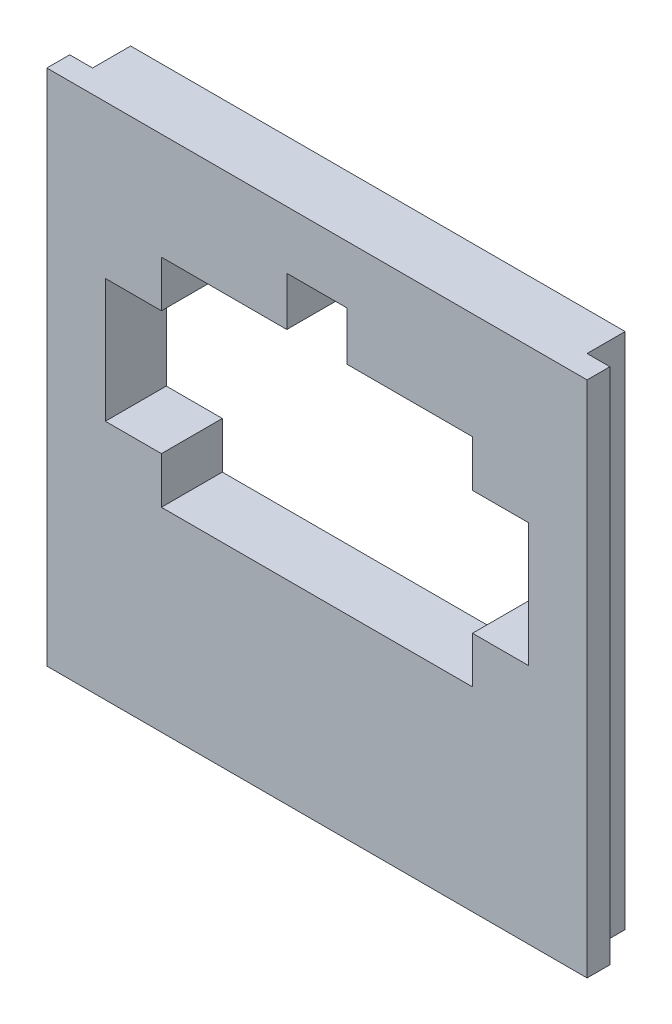
ISO-10303-21;
HEADER;
FILE_DESCRIPTION(('STEP AP214'),'2;1');
FILE_NAME('part.step','',(''),(''),'','','');
FILE_SCHEMA(('AUTOMOTIVE_DESIGN { 1 0 10303 214 1 1 1 1 }'));
ENDSEC;
DATA;
#1=APPLICATION_CONTEXT('core data for automotive mechanical design processes');
#2=APPLICATION_PROTOCOL_DEFINITION('international standard','automotive_design',2000,#1);
#3=PRODUCT_CONTEXT('',#1,'mechanical');
#4=PRODUCT('Part','Part','',(#3));
#5=PRODUCT_RELATED_PRODUCT_CATEGORY('part','',(#4));
#6=PRODUCT_DEFINITION_FORMATION('','',#4);
#7=PRODUCT_DEFINITION_CONTEXT('part definition',#1,'design');
#8=PRODUCT_DEFINITION('design','',#6,#7);
#9=PRODUCT_DEFINITION_SHAPE('','',#8);
#10=(LENGTH_UNIT() NAMED_UNIT(*) SI_UNIT(.MILLI.,.METRE.));
#11=(NAMED_UNIT(*) PLANE_ANGLE_UNIT() SI_UNIT($,.RADIAN.));
#12=(NAMED_UNIT(*) SI_UNIT($,.STERADIAN.) SOLID_ANGLE_UNIT());
#13=UNCERTAINTY_MEASURE_WITH_UNIT(LENGTH_MEASURE(1.E-05),#10,'distance_accuracy_value','');
#14=(GEOMETRIC_REPRESENTATION_CONTEXT(3) GLOBAL_UNCERTAINTY_ASSIGNED_CONTEXT((#13)) GLOBAL_UNIT_ASSIGNED_CONTEXT((#10,
#11,#12)) REPRESENTATION_CONTEXT('',''));
#15=CARTESIAN_POINT('',(0.,0.,0.));
#16=DIRECTION('',(0.,0.,1.));
#17=DIRECTION('',(1.,0.,0.));
#18=AXIS2_PLACEMENT_3D('',#15,#16,#17);
#19=CARTESIAN_POINT('',(-5.70287206266319,6.14973890339426,2.));
#20=DIRECTION('',(1.,0.,0.));
#21=DIRECTION('',(0.,1.,0.));
#22=AXIS2_PLACEMENT_3D('',#19,#20,#21);
#23=PLANE('',#22);
#24=DIRECTION('',(0.,-1.,0.));
#25=VECTOR('',#24,1.);
#26=CARTESIAN_POINT('',(-5.70287206266319,6.14973890339426,1.25));
#27=LINE('',#26,#25);
#28=CARTESIAN_POINT('',(-5.70287206266319,6.14973890339426,1.25));
#29=VERTEX_POINT('',#28);
#30=CARTESIAN_POINT('',(-5.70287206266318,-10.8502610966057,1.25));
#31=VERTEX_POINT('',#30);
#32=EDGE_CURVE('E324',#29,#31,#27,.T.);
#33=ORIENTED_EDGE('',*,*,#32,.F.);
#34=DIRECTION('',(0.,0.,-1.));
#35=VECTOR('',#34,1.);
#36=CARTESIAN_POINT('',(-5.70287206266319,6.14973890339426,2.));
#37=LINE('',#36,#35);
#38=CARTESIAN_POINT('',(-5.70287206266319,6.14973890339426,0.));
#39=VERTEX_POINT('',#38);
#40=EDGE_CURVE('E398',#29,#39,#37,.T.);
#41=ORIENTED_EDGE('',*,*,#40,.T.);
#42=DIRECTION('',(0.,-1.,0.));
#43=VECTOR('',#42,1.);
#44=CARTESIAN_POINT('',(-5.70287206266319,6.14973890339426,0.));
#45=LINE('',#44,#43);
#46=CARTESIAN_POINT('',(-5.70287206266319,-10.8502610966057,0.));
#47=VERTEX_POINT('',#46);
#48=EDGE_CURVE('E392',#39,#47,#45,.T.);
#49=ORIENTED_EDGE('',*,*,#48,.T.);
#50=DIRECTION('',(0.,0.,-1.));
#51=VECTOR('',#50,1.);
#52=CARTESIAN_POINT('',(-5.70287206266319,-10.8502610966057,2.));
#53=LINE('',#52,#51);
#54=EDGE_CURVE('E11',#31,#47,#53,.T.);
#55=ORIENTED_EDGE('',*,*,#54,.F.);
#56=EDGE_LOOP('',(#33,#41,#49,#55));
#57=FACE_BOUND('',#56,.T.);
#58=ADVANCED_FACE('F39',(#57),#23,.F.);
#59=CARTESIAN_POINT('',(10.5271279373368,6.14973890339426,2.));
#60=DIRECTION('',(-1.,0.,0.));
#61=DIRECTION('',(0.,-1.,0.));
#62=AXIS2_PLACEMENT_3D('',#59,#60,#61);
#63=PLANE('',#62);
#64=DIRECTION('',(0.,1.,0.));
#65=VECTOR('',#64,1.);
#66=CARTESIAN_POINT('',(10.5271279373368,6.14973890339426,1.251));
#67=LINE('',#66,#65);
#68=CARTESIAN_POINT('',(10.5271279373368,-10.8502610966057,1.251));
#69=VERTEX_POINT('',#68);
#70=CARTESIAN_POINT('',(10.5271279373368,6.14973890339426,1.251));
#71=VERTEX_POINT('',#70);
#72=EDGE_CURVE('E373',#69,#71,#67,.T.);
#73=ORIENTED_EDGE('',*,*,#72,.F.);
#74=DIRECTION('',(0.,0.,-1.));
#75=VECTOR('',#74,1.);
#76=CARTESIAN_POINT('',(10.5271279373368,-10.8502610966057,2.));
#77=LINE('',#76,#75);
#78=CARTESIAN_POINT('',(10.5271279373368,-10.8502610966057,0.));
#79=VERTEX_POINT('',#78);
#80=EDGE_CURVE('E46',#69,#79,#77,.T.);
#81=ORIENTED_EDGE('',*,*,#80,.T.);
#82=DIRECTION('',(0.,1.,0.));
#83=VECTOR('',#82,1.);
#84=CARTESIAN_POINT('',(10.5271279373368,6.14973890339426,0.));
#85=LINE('',#84,#83);
#86=CARTESIAN_POINT('',(10.5271279373368,6.14973890339426,0.));
#87=VERTEX_POINT('',#86);
#88=EDGE_CURVE('E404',#79,#87,#85,.T.);
#89=ORIENTED_EDGE('',*,*,#88,.T.);
#90=DIRECTION('',(0.,0.,-1.));
#91=VECTOR('',#90,1.);
#92=CARTESIAN_POINT('',(10.5271279373368,6.14973890339426,2.));
#93=LINE('',#92,#91);
#94=EDGE_CURVE('E410',#71,#87,#93,.T.);
#95=ORIENTED_EDGE('',*,*,#94,.F.);
#96=EDGE_LOOP('',(#73,#81,#89,#95));
#97=FACE_BOUND('',#96,.T.);
#98=ADVANCED_FACE('F415',(#97),#63,.F.);
#99=CARTESIAN_POINT('',(-5.70287206266319,-10.8502610966057,2.));
#100=DIRECTION('',(0.,1.,0.));
#101=DIRECTION('',(0.,0.,1.));
#102=AXIS2_PLACEMENT_3D('',#99,#100,#101);
#103=PLANE('',#102);
#104=DIRECTION('',(-1.,0.,0.));
#105=VECTOR('',#104,1.);
#106=CARTESIAN_POINT('',(5.41212793733682,-10.8502610966057,0.5));
#107=LINE('',#106,#105);
#108=CARTESIAN_POINT('',(5.41212793733682,-10.8502610966057,0.5));
#109=VERTEX_POINT('',#108);
#110=CARTESIAN_POINT('',(-0.587872062663184,-10.8502610966057,0.5));
#111=VERTEX_POINT('',#110);
#112=EDGE_CURVE('E217',#109,#111,#107,.T.);
#113=ORIENTED_EDGE('',*,*,#112,.F.);
#114=DIRECTION('',(0.,0.,-1.));
#115=VECTOR('',#114,1.);
#116=CARTESIAN_POINT('',(5.41212793733682,-10.8502610966057,0.5));
#117=LINE('',#116,#115);
#118=CARTESIAN_POINT('',(5.41212793733682,-10.8502610966057,0.));
#119=VERTEX_POINT('',#118);
#120=EDGE_CURVE('E208',#109,#119,#117,.T.);
#121=ORIENTED_EDGE('',*,*,#120,.T.);
#122=DIRECTION('',(1.,0.,0.));
#123=VECTOR('',#122,1.);
#124=CARTESIAN_POINT('',(-5.70287206266319,-10.8502610966057,0.));
#125=LINE('',#124,#123);
#126=EDGE_CURVE('E401',#119,#79,#125,.T.);
#127=ORIENTED_EDGE('',*,*,#126,.T.);
#128=ORIENTED_EDGE('',*,*,#80,.F.);
#129=DIRECTION('',(-1.,0.,0.));
#130=VECTOR('',#129,1.);
#131=CARTESIAN_POINT('',(11.2771279373368,-10.8502610966057,1.251));
#132=LINE('',#131,#130);
#133=CARTESIAN_POINT('',(11.2771279373368,-10.8502610966057,1.251));
#134=VERTEX_POINT('',#133);
#135=EDGE_CURVE('E389',#134,#69,#132,.T.);
#136=ORIENTED_EDGE('',*,*,#135,.F.);
#137=DIRECTION('',(0.,0.,-1.));
#138=VECTOR('',#137,1.);
#139=CARTESIAN_POINT('',(11.2771279373368,-10.8502610966057,2.));
#140=LINE('',#139,#138);
#141=CARTESIAN_POINT('',(11.2771279373368,-10.8502610966057,2.));
#142=VERTEX_POINT('',#141);
#143=EDGE_CURVE('E377',#142,#134,#140,.T.);
#144=ORIENTED_EDGE('',*,*,#143,.F.);
#145=DIRECTION('',(1.,0.,0.));
#146=VECTOR('',#145,1.);
#147=CARTESIAN_POINT('',(-5.70287206266319,-10.8502610966057,2.));
#148=LINE('',#147,#146);
#149=CARTESIAN_POINT('',(-6.45287206266318,-10.8502610966057,2.));
#150=VERTEX_POINT('',#149);
#151=EDGE_CURVE('E393',#150,#142,#148,.T.);
#152=ORIENTED_EDGE('',*,*,#151,.F.);
#153=DIRECTION('',(0.,0.,1.));
#154=VECTOR('',#153,1.);
#155=CARTESIAN_POINT('',(-6.45287206266318,-10.8502610966057,2.));
#156=LINE('',#155,#154);
#157=CARTESIAN_POINT('',(-6.45287206266318,-10.8502610966057,1.25));
#158=VERTEX_POINT('',#157);
#159=EDGE_CURVE('E362',#158,#150,#156,.T.);
#160=ORIENTED_EDGE('',*,*,#159,.F.);
#161=DIRECTION('',(1.,0.,0.));
#162=VECTOR('',#161,1.);
#163=CARTESIAN_POINT('',(-6.45287206266318,-10.8502610966057,1.25));
#164=LINE('',#163,#162);
#165=EDGE_CURVE('E365',#158,#31,#164,.T.);
#166=ORIENTED_EDGE('',*,*,#165,.T.);
#167=ORIENTED_EDGE('',*,*,#54,.T.);
#168=CARTESIAN_POINT('',(-0.587872062663184,-10.8502610966057,0.));
#169=VERTEX_POINT('',#168);
#170=EDGE_CURVE('E402',#47,#169,#125,.T.);
#171=ORIENTED_EDGE('',*,*,#170,.T.);
#172=DIRECTION('',(0.,0.,-1.));
#173=VECTOR('',#172,1.);
#174=CARTESIAN_POINT('',(-0.587872062663184,-10.8502610966057,0.5));
#175=LINE('',#174,#173);
#176=EDGE_CURVE('E53',#111,#169,#175,.T.);
#177=ORIENTED_EDGE('',*,*,#176,.F.);
#178=EDGE_LOOP('',(#113,#121,#127,#128,#136,#144,#152,#160,#166,#167,#171,#177));
#179=FACE_BOUND('',#178,.T.);
#180=ADVANCED_FACE('F222',(#179),#103,.F.);
#181=CARTESIAN_POINT('',(-5.70287206266319,6.14973890339426,2.));
#182=DIRECTION('',(0.,-1.,0.));
#183=DIRECTION('',(0.,0.,-1.));
#184=AXIS2_PLACEMENT_3D('',#181,#182,#183);
#185=PLANE('',#184);
#186=DIRECTION('',(-1.,0.,0.));
#187=VECTOR('',#186,1.);
#188=CARTESIAN_POINT('',(-5.70287206266319,6.14973890339426,0.));
#189=LINE('',#188,#187);
#190=EDGE_CURVE('E396',#87,#39,#189,.T.);
#191=ORIENTED_EDGE('',*,*,#190,.T.);
#192=ORIENTED_EDGE('',*,*,#40,.F.);
#193=DIRECTION('',(1.,0.,0.));
#194=VECTOR('',#193,1.);
#195=CARTESIAN_POINT('',(-6.45287206266319,6.14973890339426,1.25));
#196=LINE('',#195,#194);
#197=CARTESIAN_POINT('',(-6.45287206266319,6.14973890339426,1.25));
#198=VERTEX_POINT('',#197);
#199=EDGE_CURVE('E370',#198,#29,#196,.T.);
#200=ORIENTED_EDGE('',*,*,#199,.F.);
#201=DIRECTION('',(0.,0.,-1.));
#202=VECTOR('',#201,1.);
#203=CARTESIAN_POINT('',(-6.45287206266319,6.14973890339426,2.));
#204=LINE('',#203,#202);
#205=CARTESIAN_POINT('',(-6.45287206266319,6.14973890339426,2.));
#206=VERTEX_POINT('',#205);
#207=EDGE_CURVE('E358',#206,#198,#204,.T.);
#208=ORIENTED_EDGE('',*,*,#207,.F.);
#209=DIRECTION('',(-1.,0.,0.));
#210=VECTOR('',#209,1.);
#211=CARTESIAN_POINT('',(-5.70287206266319,6.14973890339426,2.));
#212=LINE('',#211,#210);
#213=CARTESIAN_POINT('',(11.2771279373368,6.14973890339426,2.));
#214=VERTEX_POINT('',#213);
#215=EDGE_CURVE('E395',#214,#206,#212,.T.);
#216=ORIENTED_EDGE('',*,*,#215,.F.);
#217=DIRECTION('',(0.,0.,1.));
#218=VECTOR('',#217,1.);
#219=CARTESIAN_POINT('',(11.2771279373368,6.14973890339426,2.));
#220=LINE('',#219,#218);
#221=CARTESIAN_POINT('',(11.2771279373368,6.14973890339426,1.251));
#222=VERTEX_POINT('',#221);
#223=EDGE_CURVE('E381',#222,#214,#220,.T.);
#224=ORIENTED_EDGE('',*,*,#223,.F.);
#225=DIRECTION('',(-1.,0.,0.));
#226=VECTOR('',#225,1.);
#227=CARTESIAN_POINT('',(11.2771279373368,6.14973890339426,1.251));
#228=LINE('',#227,#226);
#229=EDGE_CURVE('E384',#222,#71,#228,.T.);
#230=ORIENTED_EDGE('',*,*,#229,.T.);
#231=ORIENTED_EDGE('',*,*,#94,.T.);
#232=EDGE_LOOP('',(#191,#192,#200,#208,#216,#224,#230,#231));
#233=FACE_BOUND('',#232,.T.);
#234=ADVANCED_FACE('F424',(#233),#185,.F.);
#235=CARTESIAN_POINT('',(0.,0.,2.));
#236=DIRECTION('',(0.,0.,1.));
#237=DIRECTION('',(1.,0.,0.));
#238=AXIS2_PLACEMENT_3D('',#235,#236,#237);
#239=PLANE('',#238);
#240=DIRECTION('',(0.,-1.,0.));
#241=VECTOR('',#240,1.);
#242=CARTESIAN_POINT('',(7.51712793733682,2.65397547065038,2.));
#243=LINE('',#242,#241);
#244=CARTESIAN_POINT('',(7.51712793733682,2.65397547065038,2.));
#245=VERTEX_POINT('',#244);
#246=CARTESIAN_POINT('',(7.51712793733682,1.12897547065038,2.));
#247=VERTEX_POINT('',#246);
#248=EDGE_CURVE('E229',#245,#247,#243,.T.);
#249=ORIENTED_EDGE('',*,*,#248,.T.);
#250=DIRECTION('',(1.,0.,0.));
#251=VECTOR('',#250,1.);
#252=CARTESIAN_POINT('',(9.35712793733682,1.12897547065038,2.));
#253=LINE('',#252,#251);
#254=CARTESIAN_POINT('',(9.35712793733682,1.12897547065038,2.));
#255=VERTEX_POINT('',#254);
#256=EDGE_CURVE('E232',#247,#255,#253,.T.);
#257=ORIENTED_EDGE('',*,*,#256,.T.);
#258=DIRECTION('',(0.,-1.,0.));
#259=VECTOR('',#258,1.);
#260=CARTESIAN_POINT('',(9.35712793733682,1.12897547065038,2.));
#261=LINE('',#260,#259);
#262=CARTESIAN_POINT('',(9.35712793733682,-2.93102452934962,2.));
#263=VERTEX_POINT('',#262);
#264=EDGE_CURVE('E61',#255,#263,#261,.T.);
#265=ORIENTED_EDGE('',*,*,#264,.T.);
#266=DIRECTION('',(-1.,0.,0.));
#267=VECTOR('',#266,1.);
#268=CARTESIAN_POINT('',(9.35712793733682,-2.93102452934962,2.));
#269=LINE('',#268,#267);
#270=CARTESIAN_POINT('',(7.51712793733682,-2.93102452934962,2.));
#271=VERTEX_POINT('',#270);
#272=EDGE_CURVE('E237',#263,#271,#269,.T.);
#273=ORIENTED_EDGE('',*,*,#272,.T.);
#274=DIRECTION('',(0.,-1.,0.));
#275=VECTOR('',#274,1.);
#276=CARTESIAN_POINT('',(7.51712793733682,-4.45602452934962,2.));
#277=LINE('',#276,#275);
#278=CARTESIAN_POINT('',(7.51712793733682,-4.45602452934962,2.));
#279=VERTEX_POINT('',#278);
#280=EDGE_CURVE('E240',#271,#279,#277,.T.);
#281=ORIENTED_EDGE('',*,*,#280,.T.);
#282=DIRECTION('',(-1.,0.,0.));
#283=VECTOR('',#282,1.);
#284=CARTESIAN_POINT('',(7.51712793733682,-4.45602452934962,2.));
#285=LINE('',#284,#283);
#286=CARTESIAN_POINT('',(-2.69287206266318,-4.45602452934962,2.));
#287=VERTEX_POINT('',#286);
#288=EDGE_CURVE('E243',#279,#287,#285,.T.);
#289=ORIENTED_EDGE('',*,*,#288,.T.);
#290=DIRECTION('',(0.,1.,0.));
#291=VECTOR('',#290,1.);
#292=CARTESIAN_POINT('',(-2.69287206266318,-4.45602452934962,2.));
#293=LINE('',#292,#291);
#294=CARTESIAN_POINT('',(-2.69287206266318,-2.93102452934962,2.));
#295=VERTEX_POINT('',#294);
#296=EDGE_CURVE('E246',#287,#295,#293,.T.);
#297=ORIENTED_EDGE('',*,*,#296,.T.);
#298=DIRECTION('',(-1.,0.,0.));
#299=VECTOR('',#298,1.);
#300=CARTESIAN_POINT('',(-2.69287206266318,-2.93102452934962,2.));
#301=LINE('',#300,#299);
#302=CARTESIAN_POINT('',(-4.53287206266319,-2.93102452934962,2.));
#303=VERTEX_POINT('',#302);
#304=EDGE_CURVE('E249',#295,#303,#301,.T.);
#305=ORIENTED_EDGE('',*,*,#304,.T.);
#306=DIRECTION('',(0.,1.,0.));
#307=VECTOR('',#306,1.);
#308=CARTESIAN_POINT('',(-4.53287206266319,1.12897547065038,2.));
#309=LINE('',#308,#307);
#310=CARTESIAN_POINT('',(-4.53287206266319,1.12897547065038,2.));
#311=VERTEX_POINT('',#310);
#312=EDGE_CURVE('E252',#303,#311,#309,.T.);
#313=ORIENTED_EDGE('',*,*,#312,.T.);
#314=DIRECTION('',(1.,0.,0.));
#315=VECTOR('',#314,1.);
#316=CARTESIAN_POINT('',(-2.69287206266318,1.12897547065038,2.));
#317=LINE('',#316,#315);
#318=CARTESIAN_POINT('',(-2.69287206266318,1.12897547065038,2.));
#319=VERTEX_POINT('',#318);
#320=EDGE_CURVE('E255',#311,#319,#317,.T.);
#321=ORIENTED_EDGE('',*,*,#320,.T.);
#322=DIRECTION('',(0.,1.,0.));
#323=VECTOR('',#322,1.);
#324=CARTESIAN_POINT('',(-2.69287206266318,2.65397547065038,2.));
#325=LINE('',#324,#323);
#326=CARTESIAN_POINT('',(-2.69287206266318,2.65397547065038,2.));
#327=VERTEX_POINT('',#326);
#328=EDGE_CURVE('E258',#319,#327,#325,.T.);
#329=ORIENTED_EDGE('',*,*,#328,.T.);
#330=DIRECTION('',(1.,0.,0.));
#331=VECTOR('',#330,1.);
#332=CARTESIAN_POINT('',(1.42212793733682,2.65397547065038,2.));
#333=LINE('',#332,#331);
#334=CARTESIAN_POINT('',(1.42212793733682,2.65397547065038,2.));
#335=VERTEX_POINT('',#334);
#336=EDGE_CURVE('E261',#327,#335,#333,.T.);
#337=ORIENTED_EDGE('',*,*,#336,.T.);
#338=DIRECTION('',(0.,1.,0.));
#339=VECTOR('',#338,1.);
#340=CARTESIAN_POINT('',(1.42212793733682,4.25397547065038,2.));
#341=LINE('',#340,#339);
#342=CARTESIAN_POINT('',(1.42212793733682,4.25397547065038,2.));
#343=VERTEX_POINT('',#342);
#344=EDGE_CURVE('E264',#335,#343,#341,.T.);
#345=ORIENTED_EDGE('',*,*,#344,.T.);
#346=DIRECTION('',(1.,0.,0.));
#347=VECTOR('',#346,1.);
#348=CARTESIAN_POINT('',(3.40212793733682,4.25397547065038,2.));
#349=LINE('',#348,#347);
#350=CARTESIAN_POINT('',(3.40212793733682,4.25397547065038,2.));
#351=VERTEX_POINT('',#350);
#352=EDGE_CURVE('E267',#343,#351,#349,.T.);
#353=ORIENTED_EDGE('',*,*,#352,.T.);
#354=DIRECTION('',(0.,-1.,0.));
#355=VECTOR('',#354,1.);
#356=CARTESIAN_POINT('',(3.40212793733682,4.25397547065038,2.));
#357=LINE('',#356,#355);
#358=CARTESIAN_POINT('',(3.40212793733682,2.65397547065038,2.));
#359=VERTEX_POINT('',#358);
#360=EDGE_CURVE('E270',#351,#359,#357,.T.);
#361=ORIENTED_EDGE('',*,*,#360,.T.);
#362=DIRECTION('',(1.,0.,0.));
#363=VECTOR('',#362,1.);
#364=CARTESIAN_POINT('',(7.51712793733682,2.65397547065038,2.));
#365=LINE('',#364,#363);
#366=EDGE_CURVE('E273',#359,#245,#365,.T.);
#367=ORIENTED_EDGE('',*,*,#366,.T.);
#368=EDGE_LOOP('',(#249,#257,#265,#273,#281,#289,#297,#305,#313,#321,#329,#337,#345,#353,#361,#367));
#369=FACE_BOUND('',#368,.T.);
#370=ORIENTED_EDGE('',*,*,#215,.T.);
#371=DIRECTION('',(0.,1.,0.));
#372=VECTOR('',#371,1.);
#373=CARTESIAN_POINT('',(-6.45287206266319,6.14973890339426,2.));
#374=LINE('',#373,#372);
#375=EDGE_CURVE('E355',#150,#206,#374,.T.);
#376=ORIENTED_EDGE('',*,*,#375,.F.);
#377=ORIENTED_EDGE('',*,*,#151,.T.);
#378=DIRECTION('',(0.,-1.,0.));
#379=VECTOR('',#378,1.);
#380=CARTESIAN_POINT('',(11.2771279373368,6.14973890339426,2.));
#381=LINE('',#380,#379);
#382=EDGE_CURVE('E374',#214,#142,#381,.T.);
#383=ORIENTED_EDGE('',*,*,#382,.F.);
#384=EDGE_LOOP('',(#370,#376,#377,#383));
#385=FACE_BOUND('',#384,.T.);
#386=ADVANCED_FACE('F437',(#369,#385),#239,.T.);
#387=CARTESIAN_POINT('',(0.,0.,0.));
#388=DIRECTION('',(0.,0.,1.));
#389=DIRECTION('',(1.,0.,0.));
#390=AXIS2_PLACEMENT_3D('',#387,#388,#389);
#391=PLANE('',#390);
#392=DIRECTION('',(1.,0.,0.));
#393=VECTOR('',#392,1.);
#394=CARTESIAN_POINT('',(9.35712793733682,1.12897547065038,0.));
#395=LINE('',#394,#393);
#396=CARTESIAN_POINT('',(7.51712793733682,1.12897547065038,0.));
#397=VERTEX_POINT('',#396);
#398=CARTESIAN_POINT('',(9.35712793733682,1.12897547065038,0.));
#399=VERTEX_POINT('',#398);
#400=EDGE_CURVE('E278',#397,#399,#395,.T.);
#401=ORIENTED_EDGE('',*,*,#400,.F.);
#402=DIRECTION('',(0.,-1.,0.));
#403=VECTOR('',#402,1.);
#404=CARTESIAN_POINT('',(7.51712793733682,2.65397547065038,0.));
#405=LINE('',#404,#403);
#406=CARTESIAN_POINT('',(7.51712793733682,2.65397547065038,0.));
#407=VERTEX_POINT('',#406);
#408=EDGE_CURVE('E227',#407,#397,#405,.T.);
#409=ORIENTED_EDGE('',*,*,#408,.F.);
#410=DIRECTION('',(1.,0.,0.));
#411=VECTOR('',#410,1.);
#412=CARTESIAN_POINT('',(7.51712793733682,2.65397547065038,0.));
#413=LINE('',#412,#411);
#414=CARTESIAN_POINT('',(3.40212793733682,2.65397547065038,0.));
#415=VERTEX_POINT('',#414);
#416=EDGE_CURVE('E233',#415,#407,#413,.T.);
#417=ORIENTED_EDGE('',*,*,#416,.F.);
#418=DIRECTION('',(0.,-1.,0.));
#419=VECTOR('',#418,1.);
#420=CARTESIAN_POINT('',(3.40212793733682,4.25397547065038,0.));
#421=LINE('',#420,#419);
#422=CARTESIAN_POINT('',(3.40212793733682,4.25397547065038,0.));
#423=VERTEX_POINT('',#422);
#424=EDGE_CURVE('E317',#423,#415,#421,.T.);
#425=ORIENTED_EDGE('',*,*,#424,.F.);
#426=DIRECTION('',(1.,0.,0.));
#427=VECTOR('',#426,1.);
#428=CARTESIAN_POINT('',(3.40212793733682,4.25397547065038,0.));
#429=LINE('',#428,#427);
#430=CARTESIAN_POINT('',(1.42212793733682,4.25397547065038,0.));
#431=VERTEX_POINT('',#430);
#432=EDGE_CURVE('E314',#431,#423,#429,.T.);
#433=ORIENTED_EDGE('',*,*,#432,.F.);
#434=DIRECTION('',(0.,1.,0.));
#435=VECTOR('',#434,1.);
#436=CARTESIAN_POINT('',(1.42212793733682,4.25397547065038,0.));
#437=LINE('',#436,#435);
#438=CARTESIAN_POINT('',(1.42212793733682,2.65397547065038,0.));
#439=VERTEX_POINT('',#438);
#440=EDGE_CURVE('E311',#439,#431,#437,.T.);
#441=ORIENTED_EDGE('',*,*,#440,.F.);
#442=DIRECTION('',(1.,0.,0.));
#443=VECTOR('',#442,1.);
#444=CARTESIAN_POINT('',(1.42212793733682,2.65397547065038,0.));
#445=LINE('',#444,#443);
#446=CARTESIAN_POINT('',(-2.69287206266318,2.65397547065038,0.));
#447=VERTEX_POINT('',#446);
#448=EDGE_CURVE('E308',#447,#439,#445,.T.);
#449=ORIENTED_EDGE('',*,*,#448,.F.);
#450=DIRECTION('',(0.,1.,0.));
#451=VECTOR('',#450,1.);
#452=CARTESIAN_POINT('',(-2.69287206266318,2.65397547065038,0.));
#453=LINE('',#452,#451);
#454=CARTESIAN_POINT('',(-2.69287206266318,1.12897547065038,0.));
#455=VERTEX_POINT('',#454);
#456=EDGE_CURVE('E305',#455,#447,#453,.T.);
#457=ORIENTED_EDGE('',*,*,#456,.F.);
#458=DIRECTION('',(1.,0.,0.));
#459=VECTOR('',#458,1.);
#460=CARTESIAN_POINT('',(-2.69287206266318,1.12897547065038,0.));
#461=LINE('',#460,#459);
#462=CARTESIAN_POINT('',(-4.53287206266319,1.12897547065038,0.));
#463=VERTEX_POINT('',#462);
#464=EDGE_CURVE('E302',#463,#455,#461,.T.);
#465=ORIENTED_EDGE('',*,*,#464,.F.);
#466=DIRECTION('',(0.,1.,0.));
#467=VECTOR('',#466,1.);
#468=CARTESIAN_POINT('',(-4.53287206266319,1.12897547065038,0.));
#469=LINE('',#468,#467);
#470=CARTESIAN_POINT('',(-4.53287206266319,-2.93102452934962,0.));
#471=VERTEX_POINT('',#470);
#472=EDGE_CURVE('E299',#471,#463,#469,.T.);
#473=ORIENTED_EDGE('',*,*,#472,.F.);
#474=DIRECTION('',(-1.,0.,0.));
#475=VECTOR('',#474,1.);
#476=CARTESIAN_POINT('',(-2.69287206266318,-2.93102452934962,0.));
#477=LINE('',#476,#475);
#478=CARTESIAN_POINT('',(-2.69287206266318,-2.93102452934962,0.));
#479=VERTEX_POINT('',#478);
#480=EDGE_CURVE('E296',#479,#471,#477,.T.);
#481=ORIENTED_EDGE('',*,*,#480,.F.);
#482=DIRECTION('',(0.,1.,0.));
#483=VECTOR('',#482,1.);
#484=CARTESIAN_POINT('',(-2.69287206266318,-4.45602452934962,0.));
#485=LINE('',#484,#483);
#486=CARTESIAN_POINT('',(-2.69287206266318,-4.45602452934962,0.));
#487=VERTEX_POINT('',#486);
#488=EDGE_CURVE('E293',#487,#479,#485,.T.);
#489=ORIENTED_EDGE('',*,*,#488,.F.);
#490=DIRECTION('',(-1.,0.,0.));
#491=VECTOR('',#490,1.);
#492=CARTESIAN_POINT('',(7.51712793733682,-4.45602452934962,0.));
#493=LINE('',#492,#491);
#494=CARTESIAN_POINT('',(7.51712793733682,-4.45602452934962,0.));
#495=VERTEX_POINT('',#494);
#496=EDGE_CURVE('E290',#495,#487,#493,.T.);
#497=ORIENTED_EDGE('',*,*,#496,.F.);
#498=DIRECTION('',(0.,-1.,0.));
#499=VECTOR('',#498,1.);
#500=CARTESIAN_POINT('',(7.51712793733682,-4.45602452934962,0.));
#501=LINE('',#500,#499);
#502=CARTESIAN_POINT('',(7.51712793733682,-2.93102452934962,0.));
#503=VERTEX_POINT('',#502);
#504=EDGE_CURVE('E287',#503,#495,#501,.T.);
#505=ORIENTED_EDGE('',*,*,#504,.F.);
#506=DIRECTION('',(-1.,0.,0.));
#507=VECTOR('',#506,1.);
#508=CARTESIAN_POINT('',(9.35712793733682,-2.93102452934962,0.));
#509=LINE('',#508,#507);
#510=CARTESIAN_POINT('',(9.35712793733682,-2.93102452934962,0.));
#511=VERTEX_POINT('',#510);
#512=EDGE_CURVE('E284',#511,#503,#509,.T.);
#513=ORIENTED_EDGE('',*,*,#512,.F.);
#514=DIRECTION('',(0.,-1.,0.));
#515=VECTOR('',#514,1.);
#516=CARTESIAN_POINT('',(9.35712793733682,1.12897547065038,0.));
#517=LINE('',#516,#515);
#518=EDGE_CURVE('E281',#399,#511,#517,.T.);
#519=ORIENTED_EDGE('',*,*,#518,.F.);
#520=EDGE_LOOP('',(#401,#409,#417,#425,#433,#441,#449,#457,#465,#473,#481,#489,#497,#505,#513,#519));
#521=FACE_BOUND('',#520,.T.);
#522=ORIENTED_EDGE('',*,*,#126,.F.);
#523=CARTESIAN_POINT('',(2.41212793733682,-10.8502610966057,0.));
#524=DIRECTION('',(0.,0.,-1.));
#525=DIRECTION('',(1.,0.,0.));
#526=AXIS2_PLACEMENT_3D('',#523,#524,#525);
#527=CIRCLE('',#526,3.);
#528=EDGE_CURVE('E213',#169,#119,#527,.T.);
#529=ORIENTED_EDGE('',*,*,#528,.F.);
#530=ORIENTED_EDGE('',*,*,#170,.F.);
#531=ORIENTED_EDGE('',*,*,#48,.F.);
#532=ORIENTED_EDGE('',*,*,#190,.F.);
#533=ORIENTED_EDGE('',*,*,#88,.F.);
#534=EDGE_LOOP('',(#522,#529,#530,#531,#532,#533));
#535=FACE_BOUND('',#534,.T.);
#536=ADVANCED_FACE('F419',(#521,#535),#391,.F.);
#537=CARTESIAN_POINT('',(11.2771279373368,6.14973890339426,1.251));
#538=DIRECTION('',(0.,0.,1.));
#539=DIRECTION('',(0.,-1.,0.));
#540=AXIS2_PLACEMENT_3D('',#537,#538,#539);
#541=PLANE('',#540);
#542=ORIENTED_EDGE('',*,*,#72,.T.);
#543=ORIENTED_EDGE('',*,*,#229,.F.);
#544=DIRECTION('',(0.,1.,0.));
#545=VECTOR('',#544,1.);
#546=CARTESIAN_POINT('',(11.2771279373368,6.14973890339426,1.251));
#547=LINE('',#546,#545);
#548=EDGE_CURVE('E379',#134,#222,#547,.T.);
#549=ORIENTED_EDGE('',*,*,#548,.F.);
#550=ORIENTED_EDGE('',*,*,#135,.T.);
#551=EDGE_LOOP('',(#542,#543,#549,#550));
#552=FACE_BOUND('',#551,.T.);
#553=ADVANCED_FACE('F429',(#552),#541,.F.);
#554=CARTESIAN_POINT('',(11.2771279373368,0.,0.));
#555=DIRECTION('',(1.,0.,0.));
#556=DIRECTION('',(0.,1.,0.));
#557=AXIS2_PLACEMENT_3D('',#554,#555,#556);
#558=PLANE('',#557);
#559=ORIENTED_EDGE('',*,*,#382,.T.);
#560=ORIENTED_EDGE('',*,*,#143,.T.);
#561=ORIENTED_EDGE('',*,*,#548,.T.);
#562=ORIENTED_EDGE('',*,*,#223,.T.);
#563=EDGE_LOOP('',(#559,#560,#561,#562));
#564=FACE_BOUND('',#563,.T.);
#565=ADVANCED_FACE('F435',(#564),#558,.T.);
#566=CARTESIAN_POINT('',(-6.45287206266319,6.14973890339426,1.25));
#567=DIRECTION('',(0.,0.,1.));
#568=DIRECTION('',(0.,-1.,0.));
#569=AXIS2_PLACEMENT_3D('',#566,#567,#568);
#570=PLANE('',#569);
#571=ORIENTED_EDGE('',*,*,#32,.T.);
#572=ORIENTED_EDGE('',*,*,#165,.F.);
#573=DIRECTION('',(0.,-1.,0.));
#574=VECTOR('',#573,1.);
#575=CARTESIAN_POINT('',(-6.45287206266319,6.14973890339426,1.25));
#576=LINE('',#575,#574);
#577=EDGE_CURVE('E360',#198,#158,#576,.T.);
#578=ORIENTED_EDGE('',*,*,#577,.F.);
#579=ORIENTED_EDGE('',*,*,#199,.T.);
#580=EDGE_LOOP('',(#571,#572,#578,#579));
#581=FACE_BOUND('',#580,.T.);
#582=ADVANCED_FACE('F445',(#581),#570,.F.);
#583=CARTESIAN_POINT('',(-6.45287206266319,0.,0.));
#584=DIRECTION('',(1.,0.,0.));
#585=DIRECTION('',(0.,1.,0.));
#586=AXIS2_PLACEMENT_3D('',#583,#584,#585);
#587=PLANE('',#586);
#588=ORIENTED_EDGE('',*,*,#375,.T.);
#589=ORIENTED_EDGE('',*,*,#207,.T.);
#590=ORIENTED_EDGE('',*,*,#577,.T.);
#591=ORIENTED_EDGE('',*,*,#159,.T.);
#592=EDGE_LOOP('',(#588,#589,#590,#591));
#593=FACE_BOUND('',#592,.T.);
#594=ADVANCED_FACE('F441',(#593),#587,.F.);
#595=CARTESIAN_POINT('',(7.51712793733682,2.65397547065038,2.));
#596=DIRECTION('',(1.,0.,0.));
#597=DIRECTION('',(0.,1.,0.));
#598=AXIS2_PLACEMENT_3D('',#595,#596,#597);
#599=PLANE('',#598);
#600=ORIENTED_EDGE('',*,*,#408,.T.);
#601=DIRECTION('',(0.,0.,-1.));
#602=VECTOR('',#601,1.);
#603=CARTESIAN_POINT('',(7.51712793733682,1.12897547065038,2.));
#604=LINE('',#603,#602);
#605=EDGE_CURVE('E276',#247,#397,#604,.T.);
#606=ORIENTED_EDGE('',*,*,#605,.F.);
#607=ORIENTED_EDGE('',*,*,#248,.F.);
#608=DIRECTION('',(0.,0.,-1.));
#609=VECTOR('',#608,1.);
#610=CARTESIAN_POINT('',(7.51712793733682,2.65397547065038,2.));
#611=LINE('',#610,#609);
#612=EDGE_CURVE('E322',#245,#407,#611,.T.);
#613=ORIENTED_EDGE('',*,*,#612,.T.);
#614=EDGE_LOOP('',(#600,#606,#607,#613));
#615=FACE_BOUND('',#614,.T.);
#616=ADVANCED_FACE('F472',(#615),#599,.F.);
#617=CARTESIAN_POINT('',(7.51712793733682,2.65397547065038,2.));
#618=DIRECTION('',(0.,1.,0.));
#619=DIRECTION('',(0.,0.,1.));
#620=AXIS2_PLACEMENT_3D('',#617,#618,#619);
#621=PLANE('',#620);
#622=ORIENTED_EDGE('',*,*,#416,.T.);
#623=ORIENTED_EDGE('',*,*,#612,.F.);
#624=ORIENTED_EDGE('',*,*,#366,.F.);
#625=DIRECTION('',(0.,0.,-1.));
#626=VECTOR('',#625,1.);
#627=CARTESIAN_POINT('',(3.40212793733682,2.65397547065038,2.));
#628=LINE('',#627,#626);
#629=EDGE_CURVE('E325',#359,#415,#628,.T.);
#630=ORIENTED_EDGE('',*,*,#629,.T.);
#631=EDGE_LOOP('',(#622,#623,#624,#630));
#632=FACE_BOUND('',#631,.T.);
#633=ADVANCED_FACE('F475',(#632),#621,.F.);
#634=CARTESIAN_POINT('',(3.40212793733682,4.25397547065038,2.));
#635=DIRECTION('',(1.,0.,0.));
#636=DIRECTION('',(0.,0.,-1.));
#637=AXIS2_PLACEMENT_3D('',#634,#635,#636);
#638=PLANE('',#637);
#639=ORIENTED_EDGE('',*,*,#424,.T.);
#640=ORIENTED_EDGE('',*,*,#629,.F.);
#641=ORIENTED_EDGE('',*,*,#360,.F.);
#642=DIRECTION('',(0.,0.,-1.));
#643=VECTOR('',#642,1.);
#644=CARTESIAN_POINT('',(3.40212793733682,4.25397547065038,2.));
#645=LINE('',#644,#643);
#646=EDGE_CURVE('E327',#351,#423,#645,.T.);
#647=ORIENTED_EDGE('',*,*,#646,.T.);
#648=EDGE_LOOP('',(#639,#640,#641,#647));
#649=FACE_BOUND('',#648,.T.);
#650=ADVANCED_FACE('F527',(#649),#638,.F.);
#651=CARTESIAN_POINT('',(3.40212793733682,4.25397547065038,2.));
#652=DIRECTION('',(0.,1.,0.));
#653=DIRECTION('',(0.,0.,1.));
#654=AXIS2_PLACEMENT_3D('',#651,#652,#653);
#655=PLANE('',#654);
#656=ORIENTED_EDGE('',*,*,#432,.T.);
#657=ORIENTED_EDGE('',*,*,#646,.F.);
#658=ORIENTED_EDGE('',*,*,#352,.F.);
#659=DIRECTION('',(0.,0.,-1.));
#660=VECTOR('',#659,1.);
#661=CARTESIAN_POINT('',(1.42212793733682,4.25397547065038,2.));
#662=LINE('',#661,#660);
#663=EDGE_CURVE('E329',#343,#431,#662,.T.);
#664=ORIENTED_EDGE('',*,*,#663,.T.);
#665=EDGE_LOOP('',(#656,#657,#658,#664));
#666=FACE_BOUND('',#665,.T.);
#667=ADVANCED_FACE('F523',(#666),#655,.F.);
#668=CARTESIAN_POINT('',(1.42212793733682,4.25397547065038,2.));
#669=DIRECTION('',(-1.,0.,0.));
#670=DIRECTION('',(0.,0.,1.));
#671=AXIS2_PLACEMENT_3D('',#668,#669,#670);
#672=PLANE('',#671);
#673=ORIENTED_EDGE('',*,*,#440,.T.);
#674=ORIENTED_EDGE('',*,*,#663,.F.);
#675=ORIENTED_EDGE('',*,*,#344,.F.);
#676=DIRECTION('',(0.,0.,-1.));
#677=VECTOR('',#676,1.);
#678=CARTESIAN_POINT('',(1.42212793733682,2.65397547065038,2.));
#679=LINE('',#678,#677);
#680=EDGE_CURVE('E331',#335,#439,#679,.T.);
#681=ORIENTED_EDGE('',*,*,#680,.T.);
#682=EDGE_LOOP('',(#673,#674,#675,#681));
#683=FACE_BOUND('',#682,.T.);
#684=ADVANCED_FACE('F519',(#683),#672,.F.);
#685=CARTESIAN_POINT('',(1.42212793733682,2.65397547065038,2.));
#686=DIRECTION('',(0.,1.,0.));
#687=DIRECTION('',(0.,0.,1.));
#688=AXIS2_PLACEMENT_3D('',#685,#686,#687);
#689=PLANE('',#688);
#690=ORIENTED_EDGE('',*,*,#448,.T.);
#691=ORIENTED_EDGE('',*,*,#680,.F.);
#692=ORIENTED_EDGE('',*,*,#336,.F.);
#693=DIRECTION('',(0.,0.,-1.));
#694=VECTOR('',#693,1.);
#695=CARTESIAN_POINT('',(-2.69287206266318,2.65397547065038,2.));
#696=LINE('',#695,#694);
#697=EDGE_CURVE('E333',#327,#447,#696,.T.);
#698=ORIENTED_EDGE('',*,*,#697,.T.);
#699=EDGE_LOOP('',(#690,#691,#692,#698));
#700=FACE_BOUND('',#699,.T.);
#701=ADVANCED_FACE('F515',(#700),#689,.F.);
#702=CARTESIAN_POINT('',(-2.69287206266318,2.65397547065038,2.));
#703=DIRECTION('',(-1.,0.,0.));
#704=DIRECTION('',(0.,-1.,0.));
#705=AXIS2_PLACEMENT_3D('',#702,#703,#704);
#706=PLANE('',#705);
#707=ORIENTED_EDGE('',*,*,#456,.T.);
#708=ORIENTED_EDGE('',*,*,#697,.F.);
#709=ORIENTED_EDGE('',*,*,#328,.F.);
#710=DIRECTION('',(0.,0.,-1.));
#711=VECTOR('',#710,1.);
#712=CARTESIAN_POINT('',(-2.69287206266318,1.12897547065038,2.));
#713=LINE('',#712,#711);
#714=EDGE_CURVE('E335',#319,#455,#713,.T.);
#715=ORIENTED_EDGE('',*,*,#714,.T.);
#716=EDGE_LOOP('',(#707,#708,#709,#715));
#717=FACE_BOUND('',#716,.T.);
#718=ADVANCED_FACE('F511',(#717),#706,.F.);
#719=CARTESIAN_POINT('',(-2.69287206266318,1.12897547065038,2.));
#720=DIRECTION('',(0.,1.,0.));
#721=DIRECTION('',(0.,0.,1.));
#722=AXIS2_PLACEMENT_3D('',#719,#720,#721);
#723=PLANE('',#722);
#724=ORIENTED_EDGE('',*,*,#464,.T.);
#725=ORIENTED_EDGE('',*,*,#714,.F.);
#726=ORIENTED_EDGE('',*,*,#320,.F.);
#727=DIRECTION('',(0.,0.,-1.));
#728=VECTOR('',#727,1.);
#729=CARTESIAN_POINT('',(-4.53287206266319,1.12897547065038,2.));
#730=LINE('',#729,#728);
#731=EDGE_CURVE('E337',#311,#463,#730,.T.);
#732=ORIENTED_EDGE('',*,*,#731,.T.);
#733=EDGE_LOOP('',(#724,#725,#726,#732));
#734=FACE_BOUND('',#733,.T.);
#735=ADVANCED_FACE('F507',(#734),#723,.F.);
#736=CARTESIAN_POINT('',(-4.53287206266319,1.12897547065038,2.));
#737=DIRECTION('',(-1.,0.,0.));
#738=DIRECTION('',(0.,0.,1.));
#739=AXIS2_PLACEMENT_3D('',#736,#737,#738);
#740=PLANE('',#739);
#741=ORIENTED_EDGE('',*,*,#472,.T.);
#742=ORIENTED_EDGE('',*,*,#731,.F.);
#743=ORIENTED_EDGE('',*,*,#312,.F.);
#744=DIRECTION('',(0.,0.,-1.));
#745=VECTOR('',#744,1.);
#746=CARTESIAN_POINT('',(-4.53287206266319,-2.93102452934962,2.));
#747=LINE('',#746,#745);
#748=EDGE_CURVE('E339',#303,#471,#747,.T.);
#749=ORIENTED_EDGE('',*,*,#748,.T.);
#750=EDGE_LOOP('',(#741,#742,#743,#749));
#751=FACE_BOUND('',#750,.T.);
#752=ADVANCED_FACE('F503',(#751),#740,.F.);
#753=CARTESIAN_POINT('',(-2.69287206266318,-2.93102452934962,2.));
#754=DIRECTION('',(0.,-1.,0.));
#755=DIRECTION('',(0.,0.,-1.));
#756=AXIS2_PLACEMENT_3D('',#753,#754,#755);
#757=PLANE('',#756);
#758=ORIENTED_EDGE('',*,*,#480,.T.);
#759=ORIENTED_EDGE('',*,*,#748,.F.);
#760=ORIENTED_EDGE('',*,*,#304,.F.);
#761=DIRECTION('',(0.,0.,-1.));
#762=VECTOR('',#761,1.);
#763=CARTESIAN_POINT('',(-2.69287206266318,-2.93102452934962,2.));
#764=LINE('',#763,#762);
#765=EDGE_CURVE('E341',#295,#479,#764,.T.);
#766=ORIENTED_EDGE('',*,*,#765,.T.);
#767=EDGE_LOOP('',(#758,#759,#760,#766));
#768=FACE_BOUND('',#767,.T.);
#769=ADVANCED_FACE('F499',(#768),#757,.F.);
#770=CARTESIAN_POINT('',(-2.69287206266318,-4.45602452934962,2.));
#771=DIRECTION('',(-1.,0.,0.));
#772=DIRECTION('',(0.,0.,1.));
#773=AXIS2_PLACEMENT_3D('',#770,#771,#772);
#774=PLANE('',#773);
#775=ORIENTED_EDGE('',*,*,#488,.T.);
#776=ORIENTED_EDGE('',*,*,#765,.F.);
#777=ORIENTED_EDGE('',*,*,#296,.F.);
#778=DIRECTION('',(0.,0.,-1.));
#779=VECTOR('',#778,1.);
#780=CARTESIAN_POINT('',(-2.69287206266318,-4.45602452934962,2.));
#781=LINE('',#780,#779);
#782=EDGE_CURVE('E343',#287,#487,#781,.T.);
#783=ORIENTED_EDGE('',*,*,#782,.T.);
#784=EDGE_LOOP('',(#775,#776,#777,#783));
#785=FACE_BOUND('',#784,.T.);
#786=ADVANCED_FACE('F495',(#785),#774,.F.);
#787=CARTESIAN_POINT('',(7.51712793733682,-4.45602452934962,2.));
#788=DIRECTION('',(0.,-1.,0.));
#789=DIRECTION('',(0.,0.,-1.));
#790=AXIS2_PLACEMENT_3D('',#787,#788,#789);
#791=PLANE('',#790);
#792=ORIENTED_EDGE('',*,*,#496,.T.);
#793=ORIENTED_EDGE('',*,*,#782,.F.);
#794=ORIENTED_EDGE('',*,*,#288,.F.);
#795=DIRECTION('',(0.,0.,-1.));
#796=VECTOR('',#795,1.);
#797=CARTESIAN_POINT('',(7.51712793733682,-4.45602452934962,2.));
#798=LINE('',#797,#796);
#799=EDGE_CURVE('E345',#279,#495,#798,.T.);
#800=ORIENTED_EDGE('',*,*,#799,.T.);
#801=EDGE_LOOP('',(#792,#793,#794,#800));
#802=FACE_BOUND('',#801,.T.);
#803=ADVANCED_FACE('F491',(#802),#791,.F.);
#804=CARTESIAN_POINT('',(7.51712793733682,-4.45602452934962,2.));
#805=DIRECTION('',(1.,0.,0.));
#806=DIRECTION('',(0.,0.,-1.));
#807=AXIS2_PLACEMENT_3D('',#804,#805,#806);
#808=PLANE('',#807);
#809=ORIENTED_EDGE('',*,*,#504,.T.);
#810=ORIENTED_EDGE('',*,*,#799,.F.);
#811=ORIENTED_EDGE('',*,*,#280,.F.);
#812=DIRECTION('',(0.,0.,-1.));
#813=VECTOR('',#812,1.);
#814=CARTESIAN_POINT('',(7.51712793733682,-2.93102452934962,2.));
#815=LINE('',#814,#813);
#816=EDGE_CURVE('E347',#271,#503,#815,.T.);
#817=ORIENTED_EDGE('',*,*,#816,.T.);
#818=EDGE_LOOP('',(#809,#810,#811,#817));
#819=FACE_BOUND('',#818,.T.);
#820=ADVANCED_FACE('F487',(#819),#808,.F.);
#821=CARTESIAN_POINT('',(9.35712793733682,-2.93102452934962,2.));
#822=DIRECTION('',(0.,-1.,0.));
#823=DIRECTION('',(0.,0.,-1.));
#824=AXIS2_PLACEMENT_3D('',#821,#822,#823);
#825=PLANE('',#824);
#826=ORIENTED_EDGE('',*,*,#512,.T.);
#827=ORIENTED_EDGE('',*,*,#816,.F.);
#828=ORIENTED_EDGE('',*,*,#272,.F.);
#829=DIRECTION('',(0.,0.,-1.));
#830=VECTOR('',#829,1.);
#831=CARTESIAN_POINT('',(9.35712793733682,-2.93102452934962,2.));
#832=LINE('',#831,#830);
#833=EDGE_CURVE('E349',#263,#511,#832,.T.);
#834=ORIENTED_EDGE('',*,*,#833,.T.);
#835=EDGE_LOOP('',(#826,#827,#828,#834));
#836=FACE_BOUND('',#835,.T.);
#837=ADVANCED_FACE('F484',(#836),#825,.F.);
#838=CARTESIAN_POINT('',(9.35712793733682,1.12897547065038,2.));
#839=DIRECTION('',(1.,0.,0.));
#840=DIRECTION('',(0.,0.,-1.));
#841=AXIS2_PLACEMENT_3D('',#838,#839,#840);
#842=PLANE('',#841);
#843=ORIENTED_EDGE('',*,*,#518,.T.);
#844=ORIENTED_EDGE('',*,*,#833,.F.);
#845=ORIENTED_EDGE('',*,*,#264,.F.);
#846=DIRECTION('',(0.,0.,-1.));
#847=VECTOR('',#846,1.);
#848=CARTESIAN_POINT('',(9.35712793733682,1.12897547065038,2.));
#849=LINE('',#848,#847);
#850=EDGE_CURVE('E351',#255,#399,#849,.T.);
#851=ORIENTED_EDGE('',*,*,#850,.T.);
#852=EDGE_LOOP('',(#843,#844,#845,#851));
#853=FACE_BOUND('',#852,.T.);
#854=ADVANCED_FACE('F480',(#853),#842,.F.);
#855=CARTESIAN_POINT('',(9.35712793733682,1.12897547065038,2.));
#856=DIRECTION('',(0.,1.,0.));
#857=DIRECTION('',(0.,0.,1.));
#858=AXIS2_PLACEMENT_3D('',#855,#856,#857);
#859=PLANE('',#858);
#860=ORIENTED_EDGE('',*,*,#400,.T.);
#861=ORIENTED_EDGE('',*,*,#850,.F.);
#862=ORIENTED_EDGE('',*,*,#256,.F.);
#863=ORIENTED_EDGE('',*,*,#605,.T.);
#864=EDGE_LOOP('',(#860,#861,#862,#863));
#865=FACE_BOUND('',#864,.T.);
#866=ADVANCED_FACE('F477',(#865),#859,.F.);
#867=CARTESIAN_POINT('',(2.41212793733682,-10.8502610966057,0.5));
#868=DIRECTION('',(0.,0.,-1.));
#869=DIRECTION('',(-1.,0.,0.));
#870=AXIS2_PLACEMENT_3D('',#867,#868,#869);
#871=CYLINDRICAL_SURFACE('',#870,3.);
#872=ORIENTED_EDGE('',*,*,#528,.T.);
#873=ORIENTED_EDGE('',*,*,#120,.F.);
#874=CARTESIAN_POINT('',(2.41212793733682,-10.8502610966057,0.5));
#875=DIRECTION('',(0.,0.,-1.));
#876=DIRECTION('',(1.,0.,0.));
#877=AXIS2_PLACEMENT_3D('',#874,#875,#876);
#878=CIRCLE('',#877,3.);
#879=EDGE_CURVE('E211',#111,#109,#878,.T.);
#880=ORIENTED_EDGE('',*,*,#879,.F.);
#881=ORIENTED_EDGE('',*,*,#176,.T.);
#882=EDGE_LOOP('',(#872,#873,#880,#881));
#883=FACE_BOUND('',#882,.T.);
#884=ADVANCED_FACE('F210',(#883),#871,.F.);
#885=CARTESIAN_POINT('',(2.41212793733682,-10.8502610966057,0.5));
#886=DIRECTION('',(0.,0.,1.));
#887=DIRECTION('',(1.,0.,0.));
#888=AXIS2_PLACEMENT_3D('',#885,#886,#887);
#889=PLANE('',#888);
#890=ORIENTED_EDGE('',*,*,#879,.T.);
#891=ORIENTED_EDGE('',*,*,#112,.T.);
#892=EDGE_LOOP('',(#890,#891));
#893=FACE_BOUND('',#892,.T.);
#894=ADVANCED_FACE('F220',(#893),#889,.F.);
#895=CLOSED_SHELL('',(#58,#98,#180,#234,#386,#536,#553,#565,#582,#594,#616,#633,#650,#667,#684,
#701,#718,#735,#752,#769,#786,#803,#820,#837,#854,#866,#884,#894));
#896=MANIFOLD_SOLID_BREP('B2',#895);
#897=ADVANCED_BREP_SHAPE_REPRESENTATION('',(#18,#896),#14);
#898=SHAPE_DEFINITION_REPRESENTATION(#9,#897);
ENDSEC;
END-ISO-10303-21;
